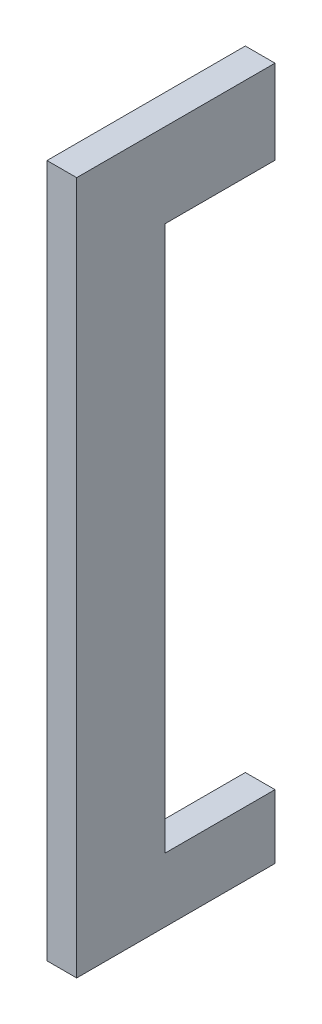
ISO-10303-21;
HEADER;
FILE_DESCRIPTION(('STEP AP214'),'2;1');
FILE_NAME('part.step','',(''),(''),'','','');
FILE_SCHEMA(('AUTOMOTIVE_DESIGN { 1 0 10303 214 1 1 1 1 }'));
ENDSEC;
DATA;
#1=APPLICATION_CONTEXT('core data for automotive mechanical design processes');
#2=APPLICATION_PROTOCOL_DEFINITION('international standard','automotive_design',2000,#1);
#3=PRODUCT_CONTEXT('',#1,'mechanical');
#4=PRODUCT('Part','Part','',(#3));
#5=PRODUCT_RELATED_PRODUCT_CATEGORY('part','',(#4));
#6=PRODUCT_DEFINITION_FORMATION('','',#4);
#7=PRODUCT_DEFINITION_CONTEXT('part definition',#1,'design');
#8=PRODUCT_DEFINITION('design','',#6,#7);
#9=PRODUCT_DEFINITION_SHAPE('','',#8);
#10=(LENGTH_UNIT() NAMED_UNIT(*) SI_UNIT(.MILLI.,.METRE.));
#11=(NAMED_UNIT(*) PLANE_ANGLE_UNIT() SI_UNIT($,.RADIAN.));
#12=(NAMED_UNIT(*) SI_UNIT($,.STERADIAN.) SOLID_ANGLE_UNIT());
#13=UNCERTAINTY_MEASURE_WITH_UNIT(LENGTH_MEASURE(1.E-05),#10,'distance_accuracy_value','');
#14=(GEOMETRIC_REPRESENTATION_CONTEXT(3) GLOBAL_UNCERTAINTY_ASSIGNED_CONTEXT((#13)) GLOBAL_UNIT_ASSIGNED_CONTEXT((#10,
#11,#12)) REPRESENTATION_CONTEXT('',''));
#15=CARTESIAN_POINT('',(0.,0.,0.));
#16=DIRECTION('',(0.,0.,1.));
#17=DIRECTION('',(1.,0.,0.));
#18=AXIS2_PLACEMENT_3D('',#15,#16,#17);
#19=CARTESIAN_POINT('',(3.,0.,0.));
#20=DIRECTION('',(0.,0.,-1.));
#21=DIRECTION('',(-1.,0.,0.));
#22=AXIS2_PLACEMENT_3D('',#19,#20,#21);
#23=PLANE('',#22);
#24=DIRECTION('',(0.,-1.,0.));
#25=VECTOR('',#24,1.);
#26=CARTESIAN_POINT('',(0.,0.,0.));
#27=LINE('',#26,#25);
#28=CARTESIAN_POINT('',(0.,70.0425461639789,0.));
#29=VERTEX_POINT('',#28);
#30=CARTESIAN_POINT('',(0.,0.,0.));
#31=VERTEX_POINT('',#30);
#32=EDGE_CURVE('E129',#29,#31,#27,.T.);
#33=ORIENTED_EDGE('',*,*,#32,.T.);
#34=DIRECTION('',(-1.,0.,0.));
#35=VECTOR('',#34,1.);
#36=CARTESIAN_POINT('',(3.,0.,0.));
#37=LINE('',#36,#35);
#38=CARTESIAN_POINT('',(3.,0.,0.));
#39=VERTEX_POINT('',#38);
#40=EDGE_CURVE('E11',#39,#31,#37,.T.);
#41=ORIENTED_EDGE('',*,*,#40,.F.);
#42=DIRECTION('',(0.,-1.,0.));
#43=VECTOR('',#42,1.);
#44=CARTESIAN_POINT('',(3.,0.,0.));
#45=LINE('',#44,#43);
#46=CARTESIAN_POINT('',(3.,70.0425461639789,0.));
#47=VERTEX_POINT('',#46);
#48=EDGE_CURVE('E143',#47,#39,#45,.T.);
#49=ORIENTED_EDGE('',*,*,#48,.F.);
#50=DIRECTION('',(-1.,0.,0.));
#51=VECTOR('',#50,1.);
#52=CARTESIAN_POINT('',(3.,70.0425461639789,0.));
#53=LINE('',#52,#51);
#54=EDGE_CURVE('E125',#47,#29,#53,.T.);
#55=ORIENTED_EDGE('',*,*,#54,.T.);
#56=EDGE_LOOP('',(#33,#41,#49,#55));
#57=FACE_BOUND('',#56,.T.);
#58=ADVANCED_FACE('F33',(#57),#23,.F.);
#59=CARTESIAN_POINT('',(3.,0.,0.));
#60=DIRECTION('',(0.,1.,0.));
#61=DIRECTION('',(0.,0.,1.));
#62=AXIS2_PLACEMENT_3D('',#59,#60,#61);
#63=PLANE('',#62);
#64=DIRECTION('',(0.,0.,-1.));
#65=VECTOR('',#64,1.);
#66=CARTESIAN_POINT('',(0.,0.,0.));
#67=LINE('',#66,#65);
#68=CARTESIAN_POINT('',(0.,0.,-20.0425461639789));
#69=VERTEX_POINT('',#68);
#70=EDGE_CURVE('E132',#31,#69,#67,.T.);
#71=ORIENTED_EDGE('',*,*,#70,.T.);
#72=DIRECTION('',(-1.,0.,0.));
#73=VECTOR('',#72,1.);
#74=CARTESIAN_POINT('',(3.,0.,-20.0425461639789));
#75=LINE('',#74,#73);
#76=CARTESIAN_POINT('',(3.,0.,-20.0425461639789));
#77=VERTEX_POINT('',#76);
#78=EDGE_CURVE('E41',#77,#69,#75,.T.);
#79=ORIENTED_EDGE('',*,*,#78,.F.);
#80=DIRECTION('',(0.,0.,-1.));
#81=VECTOR('',#80,1.);
#82=CARTESIAN_POINT('',(3.,0.,0.));
#83=LINE('',#82,#81);
#84=EDGE_CURVE('E92',#39,#77,#83,.T.);
#85=ORIENTED_EDGE('',*,*,#84,.F.);
#86=ORIENTED_EDGE('',*,*,#40,.T.);
#87=EDGE_LOOP('',(#71,#79,#85,#86));
#88=FACE_BOUND('',#87,.T.);
#89=ADVANCED_FACE('F178',(#88),#63,.F.);
#90=CARTESIAN_POINT('',(3.,0.,-20.0425461639789));
#91=DIRECTION('',(0.,0.,1.));
#92=DIRECTION('',(1.,0.,0.));
#93=AXIS2_PLACEMENT_3D('',#90,#91,#92);
#94=PLANE('',#93);
#95=DIRECTION('',(0.,1.,0.));
#96=VECTOR('',#95,1.);
#97=CARTESIAN_POINT('',(0.,0.,-20.0425461639789));
#98=LINE('',#97,#96);
#99=CARTESIAN_POINT('',(0.,6.46392539310834,-20.0425461639789));
#100=VERTEX_POINT('',#99);
#101=EDGE_CURVE('E134',#69,#100,#98,.T.);
#102=ORIENTED_EDGE('',*,*,#101,.T.);
#103=DIRECTION('',(-1.,0.,0.));
#104=VECTOR('',#103,1.);
#105=CARTESIAN_POINT('',(3.,6.46392539310834,-20.0425461639789));
#106=LINE('',#105,#104);
#107=CARTESIAN_POINT('',(3.,6.46392539310834,-20.0425461639789));
#108=VERTEX_POINT('',#107);
#109=EDGE_CURVE('E150',#108,#100,#106,.T.);
#110=ORIENTED_EDGE('',*,*,#109,.F.);
#111=DIRECTION('',(0.,1.,0.));
#112=VECTOR('',#111,1.);
#113=CARTESIAN_POINT('',(3.,0.,-20.0425461639789));
#114=LINE('',#113,#112);
#115=EDGE_CURVE('E158',#77,#108,#114,.T.);
#116=ORIENTED_EDGE('',*,*,#115,.F.);
#117=ORIENTED_EDGE('',*,*,#78,.T.);
#118=EDGE_LOOP('',(#102,#110,#116,#117));
#119=FACE_BOUND('',#118,.T.);
#120=ADVANCED_FACE('F156',(#119),#94,.F.);
#121=CARTESIAN_POINT('',(3.,6.46392539310834,-20.0425461639789));
#122=DIRECTION('',(0.,-1.,0.));
#123=DIRECTION('',(0.,0.,-1.));
#124=AXIS2_PLACEMENT_3D('',#121,#122,#123);
#125=PLANE('',#124);
#126=DIRECTION('',(0.,0.,1.));
#127=VECTOR('',#126,1.);
#128=CARTESIAN_POINT('',(0.,6.46392539310834,-20.0425461639789));
#129=LINE('',#128,#127);
#130=CARTESIAN_POINT('',(0.,6.46392539310834,-8.9437686456193));
#131=VERTEX_POINT('',#130);
#132=EDGE_CURVE('E136',#100,#131,#129,.T.);
#133=ORIENTED_EDGE('',*,*,#132,.T.);
#134=DIRECTION('',(-1.,0.,0.));
#135=VECTOR('',#134,1.);
#136=CARTESIAN_POINT('',(3.,6.46392539310834,-8.9437686456193));
#137=LINE('',#136,#135);
#138=CARTESIAN_POINT('',(3.,6.46392539310834,-8.9437686456193));
#139=VERTEX_POINT('',#138);
#140=EDGE_CURVE('E147',#139,#131,#137,.T.);
#141=ORIENTED_EDGE('',*,*,#140,.F.);
#142=DIRECTION('',(0.,0.,1.));
#143=VECTOR('',#142,1.);
#144=CARTESIAN_POINT('',(3.,6.46392539310834,-20.0425461639789));
#145=LINE('',#144,#143);
#146=EDGE_CURVE('E170',#108,#139,#145,.T.);
#147=ORIENTED_EDGE('',*,*,#146,.F.);
#148=ORIENTED_EDGE('',*,*,#109,.T.);
#149=EDGE_LOOP('',(#133,#141,#147,#148));
#150=FACE_BOUND('',#149,.T.);
#151=ADVANCED_FACE('F166',(#150),#125,.F.);
#152=CARTESIAN_POINT('',(3.,6.46392539310834,-8.9437686456193));
#153=DIRECTION('',(0.,0.,1.));
#154=DIRECTION('',(1.,0.,0.));
#155=AXIS2_PLACEMENT_3D('',#152,#153,#154);
#156=PLANE('',#155);
#157=DIRECTION('',(0.,1.,0.));
#158=VECTOR('',#157,1.);
#159=CARTESIAN_POINT('',(0.,6.46392539310834,-8.9437686456193));
#160=LINE('',#159,#158);
#161=CARTESIAN_POINT('',(0.,61.5425461639789,-8.9437686456193));
#162=VERTEX_POINT('',#161);
#163=EDGE_CURVE('E138',#131,#162,#160,.T.);
#164=ORIENTED_EDGE('',*,*,#163,.T.);
#165=DIRECTION('',(-1.,0.,0.));
#166=VECTOR('',#165,1.);
#167=CARTESIAN_POINT('',(3.,61.5425461639789,-8.9437686456193));
#168=LINE('',#167,#166);
#169=CARTESIAN_POINT('',(3.,61.5425461639789,-8.9437686456193));
#170=VERTEX_POINT('',#169);
#171=EDGE_CURVE('E120',#170,#162,#168,.T.);
#172=ORIENTED_EDGE('',*,*,#171,.F.);
#173=DIRECTION('',(0.,1.,0.));
#174=VECTOR('',#173,1.);
#175=CARTESIAN_POINT('',(3.,6.46392539310834,-8.9437686456193));
#176=LINE('',#175,#174);
#177=EDGE_CURVE('E111',#139,#170,#176,.T.);
#178=ORIENTED_EDGE('',*,*,#177,.F.);
#179=ORIENTED_EDGE('',*,*,#140,.T.);
#180=EDGE_LOOP('',(#164,#172,#178,#179));
#181=FACE_BOUND('',#180,.T.);
#182=ADVANCED_FACE('F169',(#181),#156,.F.);
#183=CARTESIAN_POINT('',(3.,61.5425461639789,-8.9437686456193));
#184=DIRECTION('',(0.,1.,0.));
#185=DIRECTION('',(0.,0.,1.));
#186=AXIS2_PLACEMENT_3D('',#183,#184,#185);
#187=PLANE('',#186);
#188=DIRECTION('',(0.,0.,-1.));
#189=VECTOR('',#188,1.);
#190=CARTESIAN_POINT('',(0.,61.5425461639789,-8.9437686456193));
#191=LINE('',#190,#189);
#192=CARTESIAN_POINT('',(0.,61.5425461639789,-20.0425461639789));
#193=VERTEX_POINT('',#192);
#194=EDGE_CURVE('E119',#162,#193,#191,.T.);
#195=ORIENTED_EDGE('',*,*,#194,.T.);
#196=DIRECTION('',(-1.,0.,0.));
#197=VECTOR('',#196,1.);
#198=CARTESIAN_POINT('',(3.,61.5425461639789,-20.0425461639789));
#199=LINE('',#198,#197);
#200=CARTESIAN_POINT('',(3.,61.5425461639789,-20.0425461639789));
#201=VERTEX_POINT('',#200);
#202=EDGE_CURVE('E116',#201,#193,#199,.T.);
#203=ORIENTED_EDGE('',*,*,#202,.F.);
#204=DIRECTION('',(0.,0.,-1.));
#205=VECTOR('',#204,1.);
#206=CARTESIAN_POINT('',(3.,61.5425461639789,-8.9437686456193));
#207=LINE('',#206,#205);
#208=EDGE_CURVE('E105',#170,#201,#207,.T.);
#209=ORIENTED_EDGE('',*,*,#208,.F.);
#210=ORIENTED_EDGE('',*,*,#171,.T.);
#211=EDGE_LOOP('',(#195,#203,#209,#210));
#212=FACE_BOUND('',#211,.T.);
#213=ADVANCED_FACE('F117',(#212),#187,.F.);
#214=CARTESIAN_POINT('',(3.,61.5425461639789,-20.0425461639789));
#215=DIRECTION('',(0.,0.,1.));
#216=DIRECTION('',(1.,0.,0.));
#217=AXIS2_PLACEMENT_3D('',#214,#215,#216);
#218=PLANE('',#217);
#219=DIRECTION('',(0.,1.,0.));
#220=VECTOR('',#219,1.);
#221=CARTESIAN_POINT('',(0.,61.5425461639789,-20.0425461639789));
#222=LINE('',#221,#220);
#223=CARTESIAN_POINT('',(0.,70.0425461639789,-20.0425461639789));
#224=VERTEX_POINT('',#223);
#225=EDGE_CURVE('E78',#193,#224,#222,.T.);
#226=ORIENTED_EDGE('',*,*,#225,.T.);
#227=DIRECTION('',(-1.,0.,0.));
#228=VECTOR('',#227,1.);
#229=CARTESIAN_POINT('',(3.,70.0425461639789,-20.0425461639789));
#230=LINE('',#229,#228);
#231=CARTESIAN_POINT('',(3.,70.0425461639789,-20.0425461639789));
#232=VERTEX_POINT('',#231);
#233=EDGE_CURVE('E121',#232,#224,#230,.T.);
#234=ORIENTED_EDGE('',*,*,#233,.F.);
#235=DIRECTION('',(0.,1.,0.));
#236=VECTOR('',#235,1.);
#237=CARTESIAN_POINT('',(3.,61.5425461639789,-20.0425461639789));
#238=LINE('',#237,#236);
#239=EDGE_CURVE('E109',#201,#232,#238,.T.);
#240=ORIENTED_EDGE('',*,*,#239,.F.);
#241=ORIENTED_EDGE('',*,*,#202,.T.);
#242=EDGE_LOOP('',(#226,#234,#240,#241));
#243=FACE_BOUND('',#242,.T.);
#244=ADVANCED_FACE('F123',(#243),#218,.F.);
#245=CARTESIAN_POINT('',(3.,70.0425461639789,0.));
#246=DIRECTION('',(0.,-1.,0.));
#247=DIRECTION('',(0.,0.,-1.));
#248=AXIS2_PLACEMENT_3D('',#245,#246,#247);
#249=PLANE('',#248);
#250=DIRECTION('',(0.,0.,1.));
#251=VECTOR('',#250,1.);
#252=CARTESIAN_POINT('',(0.,70.0425461639789,0.));
#253=LINE('',#252,#251);
#254=EDGE_CURVE('E84',#224,#29,#253,.T.);
#255=ORIENTED_EDGE('',*,*,#254,.T.);
#256=ORIENTED_EDGE('',*,*,#54,.F.);
#257=DIRECTION('',(0.,0.,1.));
#258=VECTOR('',#257,1.);
#259=CARTESIAN_POINT('',(3.,70.0425461639789,0.));
#260=LINE('',#259,#258);
#261=EDGE_CURVE('E49',#232,#47,#260,.T.);
#262=ORIENTED_EDGE('',*,*,#261,.F.);
#263=ORIENTED_EDGE('',*,*,#233,.T.);
#264=EDGE_LOOP('',(#255,#256,#262,#263));
#265=FACE_BOUND('',#264,.T.);
#266=ADVANCED_FACE('F194',(#265),#249,.F.);
#267=CARTESIAN_POINT('',(3.,0.,0.));
#268=DIRECTION('',(-1.,0.,0.));
#269=DIRECTION('',(0.,0.,1.));
#270=AXIS2_PLACEMENT_3D('',#267,#268,#269);
#271=PLANE('',#270);
#272=ORIENTED_EDGE('',*,*,#48,.T.);
#273=ORIENTED_EDGE('',*,*,#84,.T.);
#274=ORIENTED_EDGE('',*,*,#115,.T.);
#275=ORIENTED_EDGE('',*,*,#146,.T.);
#276=ORIENTED_EDGE('',*,*,#177,.T.);
#277=ORIENTED_EDGE('',*,*,#208,.T.);
#278=ORIENTED_EDGE('',*,*,#239,.T.);
#279=ORIENTED_EDGE('',*,*,#261,.T.);
#280=EDGE_LOOP('',(#272,#273,#274,#275,#276,#277,#278,#279));
#281=FACE_BOUND('',#280,.T.);
#282=ADVANCED_FACE('F107',(#281),#271,.F.);
#283=CARTESIAN_POINT('',(0.,0.,0.));
#284=DIRECTION('',(-1.,0.,0.));
#285=DIRECTION('',(0.,0.,1.));
#286=AXIS2_PLACEMENT_3D('',#283,#284,#285);
#287=PLANE('',#286);
#288=ORIENTED_EDGE('',*,*,#32,.F.);
#289=ORIENTED_EDGE('',*,*,#254,.F.);
#290=ORIENTED_EDGE('',*,*,#225,.F.);
#291=ORIENTED_EDGE('',*,*,#194,.F.);
#292=ORIENTED_EDGE('',*,*,#163,.F.);
#293=ORIENTED_EDGE('',*,*,#132,.F.);
#294=ORIENTED_EDGE('',*,*,#101,.F.);
#295=ORIENTED_EDGE('',*,*,#70,.F.);
#296=EDGE_LOOP('',(#288,#289,#290,#291,#292,#293,#294,#295));
#297=FACE_BOUND('',#296,.T.);
#298=ADVANCED_FACE('F162',(#297),#287,.T.);
#299=CLOSED_SHELL('',(#58,#89,#120,#151,#182,#213,#244,#266,#282,#298));
#300=MANIFOLD_SOLID_BREP('B2',#299);
#301=ADVANCED_BREP_SHAPE_REPRESENTATION('',(#18,#300),#14);
#302=SHAPE_DEFINITION_REPRESENTATION(#9,#301);
ENDSEC;
END-ISO-10303-21;
